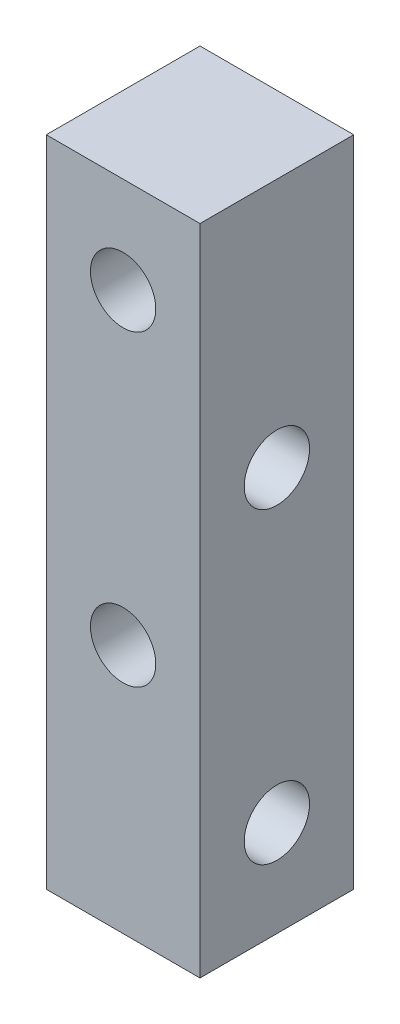
ISO-10303-21;
HEADER;
FILE_DESCRIPTION(('STEP AP214'),'2;1');
FILE_NAME('part.step','',(''),(''),'','','');
FILE_SCHEMA(('AUTOMOTIVE_DESIGN { 1 0 10303 214 1 1 1 1 }'));
ENDSEC;
DATA;
#1=APPLICATION_CONTEXT('core data for automotive mechanical design processes');
#2=APPLICATION_PROTOCOL_DEFINITION('international standard','automotive_design',2000,#1);
#3=PRODUCT_CONTEXT('',#1,'mechanical');
#4=PRODUCT('Part','Part','',(#3));
#5=PRODUCT_RELATED_PRODUCT_CATEGORY('part','',(#4));
#6=PRODUCT_DEFINITION_FORMATION('','',#4);
#7=PRODUCT_DEFINITION_CONTEXT('part definition',#1,'design');
#8=PRODUCT_DEFINITION('design','',#6,#7);
#9=PRODUCT_DEFINITION_SHAPE('','',#8);
#10=(LENGTH_UNIT() NAMED_UNIT(*) SI_UNIT(.MILLI.,.METRE.));
#11=(NAMED_UNIT(*) PLANE_ANGLE_UNIT() SI_UNIT($,.RADIAN.));
#12=(NAMED_UNIT(*) SI_UNIT($,.STERADIAN.) SOLID_ANGLE_UNIT());
#13=UNCERTAINTY_MEASURE_WITH_UNIT(LENGTH_MEASURE(1.E-05),#10,'distance_accuracy_value','');
#14=(GEOMETRIC_REPRESENTATION_CONTEXT(3) GLOBAL_UNCERTAINTY_ASSIGNED_CONTEXT((#13)) GLOBAL_UNIT_ASSIGNED_CONTEXT((#10,
#11,#12)) REPRESENTATION_CONTEXT('',''));
#15=CARTESIAN_POINT('',(0.,0.,0.));
#16=DIRECTION('',(0.,0.,1.));
#17=DIRECTION('',(1.,0.,0.));
#18=AXIS2_PLACEMENT_3D('',#15,#16,#17);
#19=CARTESIAN_POINT('',(-4.,34.,4.));
#20=DIRECTION('',(1.,0.,0.));
#21=DIRECTION('',(0.,0.,-1.));
#22=AXIS2_PLACEMENT_3D('',#19,#20,#21);
#23=PLANE('',#22);
#24=CARTESIAN_POINT('',(-4.,5.,0.));
#25=DIRECTION('',(1.,0.,0.));
#26=DIRECTION('',(0.,0.,-1.));
#27=AXIS2_PLACEMENT_3D('',#24,#25,#26);
#28=CIRCLE('',#27,1.7);
#29=CARTESIAN_POINT('',(-4.,5.,-1.7));
#30=VERTEX_POINT('',#29);
#31=EDGE_CURVE('E122',#30,#30,#28,.T.);
#32=ORIENTED_EDGE('',*,*,#31,.T.);
#33=EDGE_LOOP('',(#32));
#34=FACE_BOUND('',#33,.T.);
#35=CARTESIAN_POINT('',(-4.,21.,0.));
#36=DIRECTION('',(1.,0.,0.));
#37=DIRECTION('',(0.,0.,-1.));
#38=AXIS2_PLACEMENT_3D('',#35,#36,#37);
#39=CIRCLE('',#38,1.7);
#40=CARTESIAN_POINT('',(-4.,21.,-1.7));
#41=VERTEX_POINT('',#40);
#42=EDGE_CURVE('E127',#41,#41,#39,.T.);
#43=ORIENTED_EDGE('',*,*,#42,.T.);
#44=EDGE_LOOP('',(#43));
#45=FACE_BOUND('',#44,.T.);
#46=DIRECTION('',(0.,0.,1.));
#47=VECTOR('',#46,1.);
#48=CARTESIAN_POINT('',(-4.,0.,4.));
#49=LINE('',#48,#47);
#50=CARTESIAN_POINT('',(-4.,0.,-4.));
#51=VERTEX_POINT('',#50);
#52=CARTESIAN_POINT('',(-4.,0.,4.));
#53=VERTEX_POINT('',#52);
#54=EDGE_CURVE('E99',#51,#53,#49,.T.);
#55=ORIENTED_EDGE('',*,*,#54,.T.);
#56=DIRECTION('',(0.,-1.,0.));
#57=VECTOR('',#56,1.);
#58=CARTESIAN_POINT('',(-4.,34.,4.));
#59=LINE('',#58,#57);
#60=CARTESIAN_POINT('',(-4.,34.,4.));
#61=VERTEX_POINT('',#60);
#62=EDGE_CURVE('E11',#61,#53,#59,.T.);
#63=ORIENTED_EDGE('',*,*,#62,.F.);
#64=DIRECTION('',(0.,0.,1.));
#65=VECTOR('',#64,1.);
#66=CARTESIAN_POINT('',(-4.,34.,4.));
#67=LINE('',#66,#65);
#68=CARTESIAN_POINT('',(-4.,34.,-4.));
#69=VERTEX_POINT('',#68);
#70=EDGE_CURVE('E87',#69,#61,#67,.T.);
#71=ORIENTED_EDGE('',*,*,#70,.F.);
#72=DIRECTION('',(0.,-1.,0.));
#73=VECTOR('',#72,1.);
#74=CARTESIAN_POINT('',(-4.,34.,-4.));
#75=LINE('',#74,#73);
#76=EDGE_CURVE('E95',#69,#51,#75,.T.);
#77=ORIENTED_EDGE('',*,*,#76,.T.);
#78=EDGE_LOOP('',(#55,#63,#71,#77));
#79=FACE_BOUND('',#78,.T.);
#80=ADVANCED_FACE('F36',(#34,#45,#79),#23,.F.);
#81=CARTESIAN_POINT('',(4.,34.,4.));
#82=DIRECTION('',(0.,0.,-1.));
#83=DIRECTION('',(-1.,0.,0.));
#84=AXIS2_PLACEMENT_3D('',#81,#82,#83);
#85=PLANE('',#84);
#86=CARTESIAN_POINT('',(0.,29.,4.));
#87=DIRECTION('',(0.,0.,-1.));
#88=DIRECTION('',(-1.,0.,0.));
#89=AXIS2_PLACEMENT_3D('',#86,#87,#88);
#90=CIRCLE('',#89,1.7);
#91=CARTESIAN_POINT('',(-1.7,29.,4.));
#92=VERTEX_POINT('',#91);
#93=EDGE_CURVE('E102',#92,#92,#90,.T.);
#94=ORIENTED_EDGE('',*,*,#93,.T.);
#95=EDGE_LOOP('',(#94));
#96=FACE_BOUND('',#95,.T.);
#97=CARTESIAN_POINT('',(0.,13.,4.));
#98=DIRECTION('',(0.,0.,-1.));
#99=DIRECTION('',(-1.,0.,0.));
#100=AXIS2_PLACEMENT_3D('',#97,#98,#99);
#101=CIRCLE('',#100,1.7);
#102=CARTESIAN_POINT('',(-1.7,13.,4.));
#103=VERTEX_POINT('',#102);
#104=EDGE_CURVE('E115',#103,#103,#101,.T.);
#105=ORIENTED_EDGE('',*,*,#104,.T.);
#106=EDGE_LOOP('',(#105));
#107=FACE_BOUND('',#106,.T.);
#108=DIRECTION('',(1.,0.,0.));
#109=VECTOR('',#108,1.);
#110=CARTESIAN_POINT('',(4.,0.,4.));
#111=LINE('',#110,#109);
#112=CARTESIAN_POINT('',(4.,0.,4.));
#113=VERTEX_POINT('',#112);
#114=EDGE_CURVE('E91',#53,#113,#111,.T.);
#115=ORIENTED_EDGE('',*,*,#114,.T.);
#116=DIRECTION('',(0.,-1.,0.));
#117=VECTOR('',#116,1.);
#118=CARTESIAN_POINT('',(4.,34.,4.));
#119=LINE('',#118,#117);
#120=CARTESIAN_POINT('',(4.,34.,4.));
#121=VERTEX_POINT('',#120);
#122=EDGE_CURVE('E44',#121,#113,#119,.T.);
#123=ORIENTED_EDGE('',*,*,#122,.F.);
#124=DIRECTION('',(1.,0.,0.));
#125=VECTOR('',#124,1.);
#126=CARTESIAN_POINT('',(4.,34.,4.));
#127=LINE('',#126,#125);
#128=EDGE_CURVE('E82',#61,#121,#127,.T.);
#129=ORIENTED_EDGE('',*,*,#128,.F.);
#130=ORIENTED_EDGE('',*,*,#62,.T.);
#131=EDGE_LOOP('',(#115,#123,#129,#130));
#132=FACE_BOUND('',#131,.T.);
#133=ADVANCED_FACE('F90',(#96,#107,#132),#85,.F.);
#134=CARTESIAN_POINT('',(4.,34.,4.));
#135=DIRECTION('',(-1.,0.,0.));
#136=DIRECTION('',(0.,0.,1.));
#137=AXIS2_PLACEMENT_3D('',#134,#135,#136);
#138=PLANE('',#137);
#139=CARTESIAN_POINT('',(4.,5.,0.));
#140=DIRECTION('',(1.,0.,0.));
#141=DIRECTION('',(0.,0.,-1.));
#142=AXIS2_PLACEMENT_3D('',#139,#140,#141);
#143=CIRCLE('',#142,1.7);
#144=CARTESIAN_POINT('',(4.,5.,-1.7));
#145=VERTEX_POINT('',#144);
#146=EDGE_CURVE('E130',#145,#145,#143,.T.);
#147=ORIENTED_EDGE('',*,*,#146,.F.);
#148=EDGE_LOOP('',(#147));
#149=FACE_BOUND('',#148,.T.);
#150=CARTESIAN_POINT('',(4.,21.,0.));
#151=DIRECTION('',(1.,0.,0.));
#152=DIRECTION('',(0.,0.,-1.));
#153=AXIS2_PLACEMENT_3D('',#150,#151,#152);
#154=CIRCLE('',#153,1.7);
#155=CARTESIAN_POINT('',(4.,21.,-1.7));
#156=VERTEX_POINT('',#155);
#157=EDGE_CURVE('E131',#156,#156,#154,.T.);
#158=ORIENTED_EDGE('',*,*,#157,.F.);
#159=EDGE_LOOP('',(#158));
#160=FACE_BOUND('',#159,.T.);
#161=DIRECTION('',(0.,0.,-1.));
#162=VECTOR('',#161,1.);
#163=CARTESIAN_POINT('',(4.,0.,4.));
#164=LINE('',#163,#162);
#165=CARTESIAN_POINT('',(4.,0.,-4.));
#166=VERTEX_POINT('',#165);
#167=EDGE_CURVE('E69',#113,#166,#164,.T.);
#168=ORIENTED_EDGE('',*,*,#167,.T.);
#169=DIRECTION('',(0.,-1.,0.));
#170=VECTOR('',#169,1.);
#171=CARTESIAN_POINT('',(4.,34.,-4.));
#172=LINE('',#171,#170);
#173=CARTESIAN_POINT('',(4.,34.,-4.));
#174=VERTEX_POINT('',#173);
#175=EDGE_CURVE('E92',#174,#166,#172,.T.);
#176=ORIENTED_EDGE('',*,*,#175,.F.);
#177=DIRECTION('',(0.,0.,-1.));
#178=VECTOR('',#177,1.);
#179=CARTESIAN_POINT('',(4.,34.,4.));
#180=LINE('',#179,#178);
#181=EDGE_CURVE('E85',#121,#174,#180,.T.);
#182=ORIENTED_EDGE('',*,*,#181,.F.);
#183=ORIENTED_EDGE('',*,*,#122,.T.);
#184=EDGE_LOOP('',(#168,#176,#182,#183));
#185=FACE_BOUND('',#184,.T.);
#186=ADVANCED_FACE('F93',(#149,#160,#185),#138,.F.);
#187=CARTESIAN_POINT('',(4.,34.,-4.));
#188=DIRECTION('',(0.,0.,1.));
#189=DIRECTION('',(1.,0.,0.));
#190=AXIS2_PLACEMENT_3D('',#187,#188,#189);
#191=PLANE('',#190);
#192=CARTESIAN_POINT('',(0.,29.,-4.));
#193=DIRECTION('',(0.,0.,-1.));
#194=DIRECTION('',(-1.,0.,0.));
#195=AXIS2_PLACEMENT_3D('',#192,#193,#194);
#196=CIRCLE('',#195,1.7);
#197=CARTESIAN_POINT('',(-1.7,29.,-4.));
#198=VERTEX_POINT('',#197);
#199=EDGE_CURVE('E118',#198,#198,#196,.T.);
#200=ORIENTED_EDGE('',*,*,#199,.F.);
#201=EDGE_LOOP('',(#200));
#202=FACE_BOUND('',#201,.T.);
#203=CARTESIAN_POINT('',(0.,13.,-4.));
#204=DIRECTION('',(0.,0.,-1.));
#205=DIRECTION('',(-1.,0.,0.));
#206=AXIS2_PLACEMENT_3D('',#203,#204,#205);
#207=CIRCLE('',#206,1.7);
#208=CARTESIAN_POINT('',(-1.7,13.,-4.));
#209=VERTEX_POINT('',#208);
#210=EDGE_CURVE('E119',#209,#209,#207,.T.);
#211=ORIENTED_EDGE('',*,*,#210,.F.);
#212=EDGE_LOOP('',(#211));
#213=FACE_BOUND('',#212,.T.);
#214=DIRECTION('',(-1.,0.,0.));
#215=VECTOR('',#214,1.);
#216=CARTESIAN_POINT('',(4.,0.,-4.));
#217=LINE('',#216,#215);
#218=EDGE_CURVE('E75',#166,#51,#217,.T.);
#219=ORIENTED_EDGE('',*,*,#218,.T.);
#220=ORIENTED_EDGE('',*,*,#76,.F.);
#221=DIRECTION('',(-1.,0.,0.));
#222=VECTOR('',#221,1.);
#223=CARTESIAN_POINT('',(4.,34.,-4.));
#224=LINE('',#223,#222);
#225=EDGE_CURVE('E52',#174,#69,#224,.T.);
#226=ORIENTED_EDGE('',*,*,#225,.F.);
#227=ORIENTED_EDGE('',*,*,#175,.T.);
#228=EDGE_LOOP('',(#219,#220,#226,#227));
#229=FACE_BOUND('',#228,.T.);
#230=ADVANCED_FACE('F107',(#202,#213,#229),#191,.F.);
#231=CARTESIAN_POINT('',(0.,34.,0.));
#232=DIRECTION('',(0.,1.,0.));
#233=DIRECTION('',(0.,0.,1.));
#234=AXIS2_PLACEMENT_3D('',#231,#232,#233);
#235=PLANE('',#234);
#236=ORIENTED_EDGE('',*,*,#70,.T.);
#237=ORIENTED_EDGE('',*,*,#128,.T.);
#238=ORIENTED_EDGE('',*,*,#181,.T.);
#239=ORIENTED_EDGE('',*,*,#225,.T.);
#240=EDGE_LOOP('',(#236,#237,#238,#239));
#241=FACE_BOUND('',#240,.T.);
#242=ADVANCED_FACE('F83',(#241),#235,.T.);
#243=CARTESIAN_POINT('',(0.,0.,0.));
#244=DIRECTION('',(0.,1.,0.));
#245=DIRECTION('',(0.,0.,1.));
#246=AXIS2_PLACEMENT_3D('',#243,#244,#245);
#247=PLANE('',#246);
#248=ORIENTED_EDGE('',*,*,#54,.F.);
#249=ORIENTED_EDGE('',*,*,#218,.F.);
#250=ORIENTED_EDGE('',*,*,#167,.F.);
#251=ORIENTED_EDGE('',*,*,#114,.F.);
#252=EDGE_LOOP('',(#248,#249,#250,#251));
#253=FACE_BOUND('',#252,.T.);
#254=ADVANCED_FACE('F110',(#253),#247,.F.);
#255=CARTESIAN_POINT('',(0.,13.,30.));
#256=DIRECTION('',(0.,0.,-1.));
#257=DIRECTION('',(-1.,0.,0.));
#258=AXIS2_PLACEMENT_3D('',#255,#256,#257);
#259=CYLINDRICAL_SURFACE('',#258,1.7);
#260=ORIENTED_EDGE('',*,*,#210,.T.);
#261=EDGE_LOOP('',(#260));
#262=FACE_BOUND('',#261,.T.);
#263=ORIENTED_EDGE('',*,*,#104,.F.);
#264=EDGE_LOOP('',(#263));
#265=FACE_BOUND('',#264,.T.);
#266=ADVANCED_FACE('F166',(#262,#265),#259,.F.);
#267=CARTESIAN_POINT('',(0.,29.,30.));
#268=DIRECTION('',(0.,0.,-1.));
#269=DIRECTION('',(-1.,0.,0.));
#270=AXIS2_PLACEMENT_3D('',#267,#268,#269);
#271=CYLINDRICAL_SURFACE('',#270,1.7);
#272=ORIENTED_EDGE('',*,*,#199,.T.);
#273=EDGE_LOOP('',(#272));
#274=FACE_BOUND('',#273,.T.);
#275=ORIENTED_EDGE('',*,*,#93,.F.);
#276=EDGE_LOOP('',(#275));
#277=FACE_BOUND('',#276,.T.);
#278=ADVANCED_FACE('F148',(#274,#277),#271,.F.);
#279=CARTESIAN_POINT('',(-30.,21.,0.));
#280=DIRECTION('',(1.,0.,0.));
#281=DIRECTION('',(0.,0.,-1.));
#282=AXIS2_PLACEMENT_3D('',#279,#280,#281);
#283=CYLINDRICAL_SURFACE('',#282,1.7);
#284=ORIENTED_EDGE('',*,*,#157,.T.);
#285=EDGE_LOOP('',(#284));
#286=FACE_BOUND('',#285,.T.);
#287=ORIENTED_EDGE('',*,*,#42,.F.);
#288=EDGE_LOOP('',(#287));
#289=FACE_BOUND('',#288,.T.);
#290=ADVANCED_FACE('F145',(#286,#289),#283,.F.);
#291=CARTESIAN_POINT('',(-30.,5.,0.));
#292=DIRECTION('',(1.,0.,0.));
#293=DIRECTION('',(0.,0.,-1.));
#294=AXIS2_PLACEMENT_3D('',#291,#292,#293);
#295=CYLINDRICAL_SURFACE('',#294,1.7);
#296=ORIENTED_EDGE('',*,*,#146,.T.);
#297=EDGE_LOOP('',(#296));
#298=FACE_BOUND('',#297,.T.);
#299=ORIENTED_EDGE('',*,*,#31,.F.);
#300=EDGE_LOOP('',(#299));
#301=FACE_BOUND('',#300,.T.);
#302=ADVANCED_FACE('F137',(#298,#301),#295,.F.);
#303=CLOSED_SHELL('',(#80,#133,#186,#230,#242,#254,#266,#278,#290,#302));
#304=MANIFOLD_SOLID_BREP('B2',#303);
#305=ADVANCED_BREP_SHAPE_REPRESENTATION('',(#18,#304),#14);
#306=SHAPE_DEFINITION_REPRESENTATION(#9,#305);
ENDSEC;
END-ISO-10303-21;
